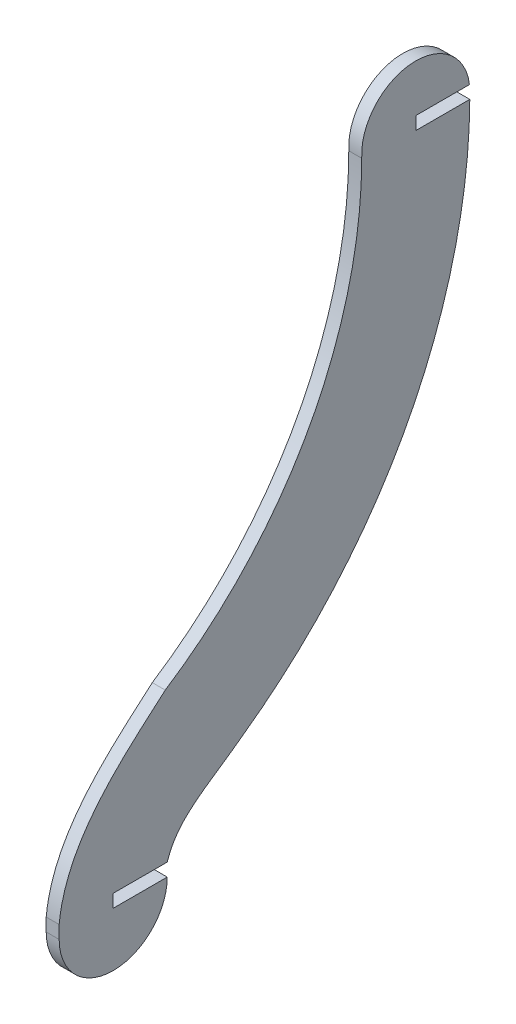
ISO-10303-21;
HEADER;
FILE_DESCRIPTION(('STEP AP214'),'2;1');
FILE_NAME('part.step','',(''),(''),'','','');
FILE_SCHEMA(('AUTOMOTIVE_DESIGN { 1 0 10303 214 1 1 1 1 }'));
ENDSEC;
DATA;
#1=APPLICATION_CONTEXT('core data for automotive mechanical design processes');
#2=APPLICATION_PROTOCOL_DEFINITION('international standard','automotive_design',2000,#1);
#3=PRODUCT_CONTEXT('',#1,'mechanical');
#4=PRODUCT('Part','Part','',(#3));
#5=PRODUCT_RELATED_PRODUCT_CATEGORY('part','',(#4));
#6=PRODUCT_DEFINITION_FORMATION('','',#4);
#7=PRODUCT_DEFINITION_CONTEXT('part definition',#1,'design');
#8=PRODUCT_DEFINITION('design','',#6,#7);
#9=PRODUCT_DEFINITION_SHAPE('','',#8);
#10=(LENGTH_UNIT() NAMED_UNIT(*) SI_UNIT(.MILLI.,.METRE.));
#11=(NAMED_UNIT(*) PLANE_ANGLE_UNIT() SI_UNIT($,.RADIAN.));
#12=(NAMED_UNIT(*) SI_UNIT($,.STERADIAN.) SOLID_ANGLE_UNIT());
#13=UNCERTAINTY_MEASURE_WITH_UNIT(LENGTH_MEASURE(1.E-05),#10,'distance_accuracy_value','');
#14=(GEOMETRIC_REPRESENTATION_CONTEXT(3) GLOBAL_UNCERTAINTY_ASSIGNED_CONTEXT((#13)) GLOBAL_UNIT_ASSIGNED_CONTEXT((#10,
#11,#12)) REPRESENTATION_CONTEXT('',''));
#15=CARTESIAN_POINT('',(0.,0.,0.));
#16=DIRECTION('',(0.,0.,1.));
#17=DIRECTION('',(1.,0.,0.));
#18=AXIS2_PLACEMENT_3D('',#15,#16,#17);
#19=CARTESIAN_POINT('',(3.,0.75,-112.5));
#20=DIRECTION('',(-1.,0.,0.));
#21=DIRECTION('',(0.,0.,1.));
#22=AXIS2_PLACEMENT_3D('',#19,#20,#21);
#23=CYLINDRICAL_SURFACE('',#22,12.5224797863682);
#24=CARTESIAN_POINT('',(3.,0.75,-112.5));
#25=DIRECTION('',(1.,0.,0.));
#26=DIRECTION('',(0.,0.,1.));
#27=AXIS2_PLACEMENT_3D('',#24,#25,#26);
#28=CIRCLE('',#27,12.5224797863682);
#29=CARTESIAN_POINT('',(3.,2.30916459984596,-124.925035442629));
#30=VERTEX_POINT('',#29);
#31=CARTESIAN_POINT('',(3.,0.,-100.));
#32=VERTEX_POINT('',#31);
#33=EDGE_CURVE('E178',#30,#32,#28,.T.);
#34=ORIENTED_EDGE('',*,*,#33,.F.);
#35=DIRECTION('',(-1.,0.,0.));
#36=VECTOR('',#35,1.);
#37=CARTESIAN_POINT('',(3.,2.30916459984596,-124.925035442629));
#38=LINE('',#37,#36);
#39=CARTESIAN_POINT('',(0.,2.30916459984596,-124.925035442629));
#40=VERTEX_POINT('',#39);
#41=EDGE_CURVE('E132',#30,#40,#38,.T.);
#42=ORIENTED_EDGE('',*,*,#41,.T.);
#43=CARTESIAN_POINT('',(0.,0.75,-112.5));
#44=DIRECTION('',(1.,0.,0.));
#45=DIRECTION('',(0.,0.,1.));
#46=AXIS2_PLACEMENT_3D('',#43,#44,#45);
#47=CIRCLE('',#46,12.5224797863682);
#48=CARTESIAN_POINT('',(0.,0.,-100.));
#49=VERTEX_POINT('',#48);
#50=EDGE_CURVE('E177',#40,#49,#47,.T.);
#51=ORIENTED_EDGE('',*,*,#50,.T.);
#52=DIRECTION('',(-1.,0.,0.));
#53=VECTOR('',#52,1.);
#54=CARTESIAN_POINT('',(3.,0.,-100.));
#55=LINE('',#54,#53);
#56=EDGE_CURVE('E40',#32,#49,#55,.T.);
#57=ORIENTED_EDGE('',*,*,#56,.F.);
#58=EDGE_LOOP('',(#34,#42,#51,#57));
#59=FACE_BOUND('',#58,.T.);
#60=ADVANCED_FACE('F33',(#59),#23,.T.);
#61=CARTESIAN_POINT('',(3.,0.,0.));
#62=DIRECTION('',(-1.,0.,0.));
#63=DIRECTION('',(0.,0.,1.));
#64=AXIS2_PLACEMENT_3D('',#61,#62,#63);
#65=CYLINDRICAL_SURFACE('',#64,100.);
#66=CARTESIAN_POINT('',(0.,0.,0.));
#67=DIRECTION('',(-1.,0.,0.));
#68=DIRECTION('',(0.,0.,1.));
#69=AXIS2_PLACEMENT_3D('',#66,#67,#68);
#70=CIRCLE('',#69,100.);
#71=CARTESIAN_POINT('',(0.,-83.8152651696344,-54.543572715251));
#72=VERTEX_POINT('',#71);
#73=EDGE_CURVE('E210',#49,#72,#70,.T.);
#74=ORIENTED_EDGE('',*,*,#73,.T.);
#75=DIRECTION('',(-1.,0.,0.));
#76=VECTOR('',#75,1.);
#77=CARTESIAN_POINT('',(3.,-83.8152651696344,-54.543572715251));
#78=LINE('',#77,#76);
#79=CARTESIAN_POINT('',(3.,-83.8152651696344,-54.543572715251));
#80=VERTEX_POINT('',#79);
#81=EDGE_CURVE('E213',#80,#72,#78,.T.);
#82=ORIENTED_EDGE('',*,*,#81,.F.);
#83=CARTESIAN_POINT('',(3.,0.,0.));
#84=DIRECTION('',(-1.,0.,0.));
#85=DIRECTION('',(0.,0.,1.));
#86=AXIS2_PLACEMENT_3D('',#83,#84,#85);
#87=CIRCLE('',#86,100.);
#88=EDGE_CURVE('E180',#32,#80,#87,.T.);
#89=ORIENTED_EDGE('',*,*,#88,.F.);
#90=ORIENTED_EDGE('',*,*,#56,.T.);
#91=EDGE_LOOP('',(#74,#82,#89,#90));
#92=FACE_BOUND('',#91,.T.);
#93=ADVANCED_FACE('F198',(#92),#65,.F.);
#94=CARTESIAN_POINT('',(3.,-83.8152651696344,-54.543572715251));
#95=CARTESIAN_POINT('',(3.,-92.6089409882353,-44.4344367811976));
#96=CARTESIAN_POINT('',(3.,-102.945692353055,-31.581333533884));
#97=CARTESIAN_POINT('',(3.,-118.5,-30.0000000000005));
#98=B_SPLINE_CURVE_WITH_KNOTS('',3,(#94,#95,#96,#97),.UNSPECIFIED.,.F.,.F.,(4,4),(0.,1.),.UNSPECIFIED.);
#99=DIRECTION('',(-1.,0.,0.));
#100=VECTOR('',#99,1.);
#101=SURFACE_OF_LINEAR_EXTRUSION('',#98,#100);
#102=CARTESIAN_POINT('',(0.,-83.8152651696344,-54.543572715251));
#103=CARTESIAN_POINT('',(0.,-92.6089409882353,-44.4344367811976));
#104=CARTESIAN_POINT('',(0.,-102.945692353055,-31.581333533884));
#105=CARTESIAN_POINT('',(0.,-118.5,-30.0000000000005));
#106=B_SPLINE_CURVE_WITH_KNOTS('',3,(#102,#103,#104,#105),.UNSPECIFIED.,.F.,.F.,(4,4),(0.,1.),.UNSPECIFIED.);
#107=CARTESIAN_POINT('',(0.,-118.5,-30.0000000000005));
#108=VERTEX_POINT('',#107);
#109=EDGE_CURVE('E217',#72,#108,#106,.T.);
#110=ORIENTED_EDGE('',*,*,#109,.T.);
#111=DIRECTION('',(-1.,0.,0.));
#112=VECTOR('',#111,1.);
#113=CARTESIAN_POINT('',(3.,-118.5,-30.0000000000005));
#114=LINE('',#113,#112);
#115=CARTESIAN_POINT('',(3.,-118.5,-30.0000000000005));
#116=VERTEX_POINT('',#115);
#117=EDGE_CURVE('E221',#116,#108,#114,.T.);
#118=ORIENTED_EDGE('',*,*,#117,.F.);
#119=EDGE_CURVE('E183',#80,#116,#98,.T.);
#120=ORIENTED_EDGE('',*,*,#119,.F.);
#121=ORIENTED_EDGE('',*,*,#81,.T.);
#122=EDGE_LOOP('',(#110,#118,#120,#121));
#123=FACE_BOUND('',#122,.T.);
#124=ADVANCED_FACE('F194',(#123),#101,.F.);
#125=CARTESIAN_POINT('',(3.,-118.5,-30.0000000000005));
#126=DIRECTION('',(0.,0.,-1.));
#127=DIRECTION('',(0.,1.,0.));
#128=AXIS2_PLACEMENT_3D('',#125,#126,#127);
#129=PLANE('',#128);
#130=DIRECTION('',(0.,-1.,0.));
#131=VECTOR('',#130,1.);
#132=CARTESIAN_POINT('',(0.,-118.5,-30.0000000000005));
#133=LINE('',#132,#131);
#134=CARTESIAN_POINT('',(0.,-121.5,-30.0000000000005));
#135=VERTEX_POINT('',#134);
#136=EDGE_CURVE('E225',#108,#135,#133,.T.);
#137=ORIENTED_EDGE('',*,*,#136,.T.);
#138=DIRECTION('',(-1.,0.,0.));
#139=VECTOR('',#138,1.);
#140=CARTESIAN_POINT('',(3.,-121.5,-30.0000000000005));
#141=LINE('',#140,#139);
#142=CARTESIAN_POINT('',(3.,-121.5,-30.0000000000005));
#143=VERTEX_POINT('',#142);
#144=EDGE_CURVE('E255',#143,#135,#141,.T.);
#145=ORIENTED_EDGE('',*,*,#144,.F.);
#146=DIRECTION('',(0.,-1.,0.));
#147=VECTOR('',#146,1.);
#148=CARTESIAN_POINT('',(3.,-118.5,-30.0000000000005));
#149=LINE('',#148,#147);
#150=EDGE_CURVE('E188',#116,#143,#149,.T.);
#151=ORIENTED_EDGE('',*,*,#150,.F.);
#152=ORIENTED_EDGE('',*,*,#117,.T.);
#153=EDGE_LOOP('',(#137,#145,#151,#152));
#154=FACE_BOUND('',#153,.T.);
#155=ADVANCED_FACE('F197',(#154),#129,.F.);
#156=CARTESIAN_POINT('',(3.,-121.5,-42.5000000000005));
#157=DIRECTION('',(-1.,0.,0.));
#158=DIRECTION('',(0.,0.,1.));
#159=AXIS2_PLACEMENT_3D('',#156,#157,#158);
#160=CYLINDRICAL_SURFACE('',#159,12.5);
#161=CARTESIAN_POINT('',(0.,-121.5,-42.5000000000005));
#162=DIRECTION('',(1.,0.,0.));
#163=DIRECTION('',(0.,0.,1.));
#164=AXIS2_PLACEMENT_3D('',#161,#162,#163);
#165=CIRCLE('',#164,12.5);
#166=CARTESIAN_POINT('',(0.,-121.5,-55.0000000000005));
#167=VERTEX_POINT('',#166);
#168=EDGE_CURVE('E227',#135,#167,#165,.T.);
#169=ORIENTED_EDGE('',*,*,#168,.T.);
#170=DIRECTION('',(-1.,0.,0.));
#171=VECTOR('',#170,1.);
#172=CARTESIAN_POINT('',(3.,-121.5,-55.0000000000005));
#173=LINE('',#172,#171);
#174=CARTESIAN_POINT('',(3.,-121.5,-55.0000000000005));
#175=VERTEX_POINT('',#174);
#176=EDGE_CURVE('E253',#175,#167,#173,.T.);
#177=ORIENTED_EDGE('',*,*,#176,.F.);
#178=CARTESIAN_POINT('',(3.,-121.5,-42.5000000000005));
#179=DIRECTION('',(1.,0.,0.));
#180=DIRECTION('',(0.,0.,1.));
#181=AXIS2_PLACEMENT_3D('',#178,#179,#180);
#182=CIRCLE('',#181,12.5);
#183=EDGE_CURVE('E264',#143,#175,#182,.T.);
#184=ORIENTED_EDGE('',*,*,#183,.F.);
#185=ORIENTED_EDGE('',*,*,#144,.T.);
#186=EDGE_LOOP('',(#169,#177,#184,#185));
#187=FACE_BOUND('',#186,.T.);
#188=ADVANCED_FACE('F281',(#187),#160,.T.);
#189=CARTESIAN_POINT('',(3.,-118.5,-55.0000000000005));
#190=CARTESIAN_POINT('',(3.,-110.868607185176,-57.3842878123047));
#191=CARTESIAN_POINT('',(3.,-107.86064176135,-64.5488560780221));
#192=CARTESIAN_POINT('',(3.,-101.935620664826,-72.3472821858341));
#193=B_SPLINE_CURVE_WITH_KNOTS('',3,(#189,#190,#191,#192),.UNSPECIFIED.,.F.,.F.,(4,4),(0.,1.),.UNSPECIFIED.);
#194=DIRECTION('',(-1.,0.,0.));
#195=VECTOR('',#194,1.);
#196=SURFACE_OF_LINEAR_EXTRUSION('',#193,#195);
#197=CARTESIAN_POINT('',(0.,-118.5,-55.0000000000005));
#198=CARTESIAN_POINT('',(0.,-110.868607185176,-57.3842878123047));
#199=CARTESIAN_POINT('',(0.,-107.86064176135,-64.5488560780221));
#200=CARTESIAN_POINT('',(0.,-101.935620664826,-72.3472821858341));
#201=B_SPLINE_CURVE_WITH_KNOTS('',3,(#197,#198,#199,#200),.UNSPECIFIED.,.F.,.F.,(4,4),(0.,1.),.UNSPECIFIED.);
#202=CARTESIAN_POINT('',(0.,-118.5,-55.0000000000005));
#203=VERTEX_POINT('',#202);
#204=CARTESIAN_POINT('',(0.,-101.935620664826,-72.3472821858341));
#205=VERTEX_POINT('',#204);
#206=EDGE_CURVE('E238',#203,#205,#201,.T.);
#207=ORIENTED_EDGE('',*,*,#206,.T.);
#208=DIRECTION('',(-1.,0.,0.));
#209=VECTOR('',#208,1.);
#210=CARTESIAN_POINT('',(3.,-101.935620664826,-72.3472821858341));
#211=LINE('',#210,#209);
#212=CARTESIAN_POINT('',(3.,-101.935620664826,-72.3472821858341));
#213=VERTEX_POINT('',#212);
#214=EDGE_CURVE('E246',#213,#205,#211,.T.);
#215=ORIENTED_EDGE('',*,*,#214,.F.);
#216=CARTESIAN_POINT('',(3.,-118.5,-55.0000000000005));
#217=VERTEX_POINT('',#216);
#218=EDGE_CURVE('E265',#217,#213,#193,.T.);
#219=ORIENTED_EDGE('',*,*,#218,.F.);
#220=DIRECTION('',(-1.,0.,0.));
#221=VECTOR('',#220,1.);
#222=CARTESIAN_POINT('',(3.,-118.5,-55.0000000000005));
#223=LINE('',#222,#221);
#224=EDGE_CURVE('E249',#217,#203,#223,.T.);
#225=ORIENTED_EDGE('',*,*,#224,.T.);
#226=EDGE_LOOP('',(#207,#215,#219,#225));
#227=FACE_BOUND('',#226,.T.);
#228=ADVANCED_FACE('F277',(#227),#196,.F.);
#229=CARTESIAN_POINT('',(3.,0.,0.));
#230=DIRECTION('',(-1.,0.,0.));
#231=DIRECTION('',(0.,0.,1.));
#232=AXIS2_PLACEMENT_3D('',#229,#230,#231);
#233=CYLINDRICAL_SURFACE('',#232,125.);
#234=CARTESIAN_POINT('',(0.,0.,0.));
#235=DIRECTION('',(1.,0.,0.));
#236=DIRECTION('',(0.,0.,1.));
#237=AXIS2_PLACEMENT_3D('',#234,#235,#236);
#238=CIRCLE('',#237,125.);
#239=CARTESIAN_POINT('',(0.,-0.690835400154035,-124.998090971222));
#240=VERTEX_POINT('',#239);
#241=EDGE_CURVE('E181',#205,#240,#238,.T.);
#242=ORIENTED_EDGE('',*,*,#241,.T.);
#243=DIRECTION('',(-1.,0.,0.));
#244=VECTOR('',#243,1.);
#245=CARTESIAN_POINT('',(3.,-0.690835400154035,-124.998090971222));
#246=LINE('',#245,#244);
#247=CARTESIAN_POINT('',(3.,-0.690835400154035,-124.998090971222));
#248=VERTEX_POINT('',#247);
#249=EDGE_CURVE('E139',#240,#248,#246,.F.);
#250=ORIENTED_EDGE('',*,*,#249,.T.);
#251=CARTESIAN_POINT('',(3.,0.,0.));
#252=DIRECTION('',(1.,0.,0.));
#253=DIRECTION('',(0.,0.,1.));
#254=AXIS2_PLACEMENT_3D('',#251,#252,#253);
#255=CIRCLE('',#254,125.);
#256=EDGE_CURVE('E250',#213,#248,#255,.T.);
#257=ORIENTED_EDGE('',*,*,#256,.F.);
#258=ORIENTED_EDGE('',*,*,#214,.T.);
#259=EDGE_LOOP('',(#242,#250,#257,#258));
#260=FACE_BOUND('',#259,.T.);
#261=ADVANCED_FACE('F280',(#260),#233,.T.);
#262=CARTESIAN_POINT('',(3.,0.75,-112.5));
#263=DIRECTION('',(-1.,0.,0.));
#264=DIRECTION('',(0.,0.,1.));
#265=AXIS2_PLACEMENT_3D('',#262,#263,#264);
#266=PLANE('',#265);
#267=ORIENTED_EDGE('',*,*,#256,.T.);
#268=DIRECTION('',(0.,0.,-1.));
#269=VECTOR('',#268,1.);
#270=CARTESIAN_POINT('',(3.,-0.690835400154035,-125.));
#271=LINE('',#270,#269);
#272=CARTESIAN_POINT('',(3.,-0.690835400154037,-112.5));
#273=VERTEX_POINT('',#272);
#274=EDGE_CURVE('E147',#273,#248,#271,.T.);
#275=ORIENTED_EDGE('',*,*,#274,.F.);
#276=DIRECTION('',(0.,-1.,0.));
#277=VECTOR('',#276,1.);
#278=CARTESIAN_POINT('',(3.,-0.690835400154037,-112.5));
#279=LINE('',#278,#277);
#280=CARTESIAN_POINT('',(3.,2.30916459984596,-112.5));
#281=VERTEX_POINT('',#280);
#282=EDGE_CURVE('E129',#281,#273,#279,.T.);
#283=ORIENTED_EDGE('',*,*,#282,.F.);
#284=DIRECTION('',(0.,0.,1.));
#285=VECTOR('',#284,1.);
#286=CARTESIAN_POINT('',(3.,2.30916459984596,-125.));
#287=LINE('',#286,#285);
#288=EDGE_CURVE('E151',#30,#281,#287,.T.);
#289=ORIENTED_EDGE('',*,*,#288,.F.);
#290=ORIENTED_EDGE('',*,*,#33,.T.);
#291=ORIENTED_EDGE('',*,*,#88,.T.);
#292=ORIENTED_EDGE('',*,*,#119,.T.);
#293=ORIENTED_EDGE('',*,*,#150,.T.);
#294=ORIENTED_EDGE('',*,*,#183,.T.);
#295=DIRECTION('',(0.,0.,-1.));
#296=VECTOR('',#295,1.);
#297=CARTESIAN_POINT('',(3.,-121.5,-55.0000000000005));
#298=LINE('',#297,#296);
#299=CARTESIAN_POINT('',(3.,-121.5,-42.5000000000005));
#300=VERTEX_POINT('',#299);
#301=EDGE_CURVE('E159',#300,#175,#298,.T.);
#302=ORIENTED_EDGE('',*,*,#301,.F.);
#303=DIRECTION('',(0.,-1.,0.));
#304=VECTOR('',#303,1.);
#305=CARTESIAN_POINT('',(3.,-118.5,-42.5000000000005));
#306=LINE('',#305,#304);
#307=CARTESIAN_POINT('',(3.,-118.5,-42.5000000000005));
#308=VERTEX_POINT('',#307);
#309=EDGE_CURVE('E168',#308,#300,#306,.T.);
#310=ORIENTED_EDGE('',*,*,#309,.F.);
#311=DIRECTION('',(0.,0.,1.));
#312=VECTOR('',#311,1.);
#313=CARTESIAN_POINT('',(3.,-118.5,-55.0000000000005));
#314=LINE('',#313,#312);
#315=EDGE_CURVE('E165',#217,#308,#314,.T.);
#316=ORIENTED_EDGE('',*,*,#315,.F.);
#317=ORIENTED_EDGE('',*,*,#218,.T.);
#318=EDGE_LOOP('',(#267,#275,#283,#289,#290,#291,#292,#293,#294,#302,#310,#316,#317));
#319=FACE_BOUND('',#318,.T.);
#320=ADVANCED_FACE('F294',(#319),#266,.F.);
#321=CARTESIAN_POINT('',(0.,0.75,-112.5));
#322=DIRECTION('',(-1.,0.,0.));
#323=DIRECTION('',(0.,0.,1.));
#324=AXIS2_PLACEMENT_3D('',#321,#322,#323);
#325=PLANE('',#324);
#326=DIRECTION('',(0.,0.,-1.));
#327=VECTOR('',#326,1.);
#328=CARTESIAN_POINT('',(0.,-0.690835400154035,-125.));
#329=LINE('',#328,#327);
#330=CARTESIAN_POINT('',(0.,-0.690835400154037,-112.5));
#331=VERTEX_POINT('',#330);
#332=EDGE_CURVE('E136',#331,#240,#329,.T.);
#333=ORIENTED_EDGE('',*,*,#332,.T.);
#334=ORIENTED_EDGE('',*,*,#241,.F.);
#335=ORIENTED_EDGE('',*,*,#206,.F.);
#336=DIRECTION('',(0.,0.,1.));
#337=VECTOR('',#336,1.);
#338=CARTESIAN_POINT('',(0.,-118.5,-55.0000000000005));
#339=LINE('',#338,#337);
#340=CARTESIAN_POINT('',(0.,-118.5,-42.5000000000005));
#341=VERTEX_POINT('',#340);
#342=EDGE_CURVE('E156',#203,#341,#339,.T.);
#343=ORIENTED_EDGE('',*,*,#342,.T.);
#344=DIRECTION('',(0.,-1.,0.));
#345=VECTOR('',#344,1.);
#346=CARTESIAN_POINT('',(0.,-118.5,-42.5000000000005));
#347=LINE('',#346,#345);
#348=CARTESIAN_POINT('',(0.,-121.5,-42.5000000000005));
#349=VERTEX_POINT('',#348);
#350=EDGE_CURVE('E55',#341,#349,#347,.T.);
#351=ORIENTED_EDGE('',*,*,#350,.T.);
#352=DIRECTION('',(0.,0.,-1.));
#353=VECTOR('',#352,1.);
#354=CARTESIAN_POINT('',(0.,-121.5,-55.0000000000005));
#355=LINE('',#354,#353);
#356=EDGE_CURVE('E161',#349,#167,#355,.T.);
#357=ORIENTED_EDGE('',*,*,#356,.T.);
#358=ORIENTED_EDGE('',*,*,#168,.F.);
#359=ORIENTED_EDGE('',*,*,#136,.F.);
#360=ORIENTED_EDGE('',*,*,#109,.F.);
#361=ORIENTED_EDGE('',*,*,#73,.F.);
#362=ORIENTED_EDGE('',*,*,#50,.F.);
#363=DIRECTION('',(0.,0.,-1.));
#364=VECTOR('',#363,1.);
#365=CARTESIAN_POINT('',(0.,2.30916459984596,-112.5));
#366=LINE('',#365,#364);
#367=CARTESIAN_POINT('',(0.,2.30916459984596,-112.5));
#368=VERTEX_POINT('',#367);
#369=EDGE_CURVE('E11',#368,#40,#366,.T.);
#370=ORIENTED_EDGE('',*,*,#369,.F.);
#371=DIRECTION('',(0.,-1.,0.));
#372=VECTOR('',#371,1.);
#373=CARTESIAN_POINT('',(0.,-0.690835400154037,-112.5));
#374=LINE('',#373,#372);
#375=EDGE_CURVE('E47',#368,#331,#374,.T.);
#376=ORIENTED_EDGE('',*,*,#375,.T.);
#377=EDGE_LOOP('',(#333,#334,#335,#343,#351,#357,#358,#359,#360,#361,#362,#370,#376));
#378=FACE_BOUND('',#377,.T.);
#379=ADVANCED_FACE('F145',(#378),#325,.T.);
#380=CARTESIAN_POINT('',(0.,-121.5,-55.0000000000005));
#381=DIRECTION('',(0.,-1.,0.));
#382=DIRECTION('',(0.,0.,-1.));
#383=AXIS2_PLACEMENT_3D('',#380,#381,#382);
#384=PLANE('',#383);
#385=ORIENTED_EDGE('',*,*,#301,.T.);
#386=ORIENTED_EDGE('',*,*,#176,.T.);
#387=ORIENTED_EDGE('',*,*,#356,.F.);
#388=DIRECTION('',(1.,0.,0.));
#389=VECTOR('',#388,1.);
#390=CARTESIAN_POINT('',(0.,-121.5,-42.5000000000005));
#391=LINE('',#390,#389);
#392=EDGE_CURVE('E153',#349,#300,#391,.T.);
#393=ORIENTED_EDGE('',*,*,#392,.T.);
#394=EDGE_LOOP('',(#385,#386,#387,#393));
#395=FACE_BOUND('',#394,.T.);
#396=ADVANCED_FACE('F291',(#395),#384,.F.);
#397=CARTESIAN_POINT('',(0.,-118.5,-42.5000000000005));
#398=DIRECTION('',(0.,0.,1.));
#399=DIRECTION('',(1.,0.,0.));
#400=AXIS2_PLACEMENT_3D('',#397,#398,#399);
#401=PLANE('',#400);
#402=ORIENTED_EDGE('',*,*,#309,.T.);
#403=ORIENTED_EDGE('',*,*,#392,.F.);
#404=ORIENTED_EDGE('',*,*,#350,.F.);
#405=DIRECTION('',(1.,0.,0.));
#406=VECTOR('',#405,1.);
#407=CARTESIAN_POINT('',(0.,-118.5,-42.5000000000005));
#408=LINE('',#407,#406);
#409=EDGE_CURVE('E164',#341,#308,#408,.T.);
#410=ORIENTED_EDGE('',*,*,#409,.T.);
#411=EDGE_LOOP('',(#402,#403,#404,#410));
#412=FACE_BOUND('',#411,.T.);
#413=ADVANCED_FACE('F297',(#412),#401,.F.);
#414=CARTESIAN_POINT('',(0.,-118.5,-55.0000000000005));
#415=DIRECTION('',(0.,1.,0.));
#416=DIRECTION('',(0.,0.,1.));
#417=AXIS2_PLACEMENT_3D('',#414,#415,#416);
#418=PLANE('',#417);
#419=ORIENTED_EDGE('',*,*,#315,.T.);
#420=ORIENTED_EDGE('',*,*,#409,.F.);
#421=ORIENTED_EDGE('',*,*,#342,.F.);
#422=ORIENTED_EDGE('',*,*,#224,.F.);
#423=EDGE_LOOP('',(#419,#420,#421,#422));
#424=FACE_BOUND('',#423,.T.);
#425=ADVANCED_FACE('F299',(#424),#418,.F.);
#426=CARTESIAN_POINT('',(0.,-0.690835400154035,-125.));
#427=DIRECTION('',(0.,-1.,0.));
#428=DIRECTION('',(0.,0.,-1.));
#429=AXIS2_PLACEMENT_3D('',#426,#427,#428);
#430=PLANE('',#429);
#431=ORIENTED_EDGE('',*,*,#332,.F.);
#432=DIRECTION('',(1.,0.,0.));
#433=VECTOR('',#432,1.);
#434=CARTESIAN_POINT('',(0.,-0.690835400154037,-112.5));
#435=LINE('',#434,#433);
#436=EDGE_CURVE('E125',#331,#273,#435,.T.);
#437=ORIENTED_EDGE('',*,*,#436,.T.);
#438=ORIENTED_EDGE('',*,*,#274,.T.);
#439=ORIENTED_EDGE('',*,*,#249,.F.);
#440=EDGE_LOOP('',(#431,#437,#438,#439));
#441=FACE_BOUND('',#440,.T.);
#442=ADVANCED_FACE('F137',(#441),#430,.F.);
#443=CARTESIAN_POINT('',(0.,2.30916459984596,-125.));
#444=DIRECTION('',(0.,1.,0.));
#445=DIRECTION('',(0.,0.,1.));
#446=AXIS2_PLACEMENT_3D('',#443,#444,#445);
#447=PLANE('',#446);
#448=ORIENTED_EDGE('',*,*,#288,.T.);
#449=DIRECTION('',(1.,0.,0.));
#450=VECTOR('',#449,1.);
#451=CARTESIAN_POINT('',(0.,2.30916459984596,-112.5));
#452=LINE('',#451,#450);
#453=EDGE_CURVE('E133',#368,#281,#452,.T.);
#454=ORIENTED_EDGE('',*,*,#453,.F.);
#455=ORIENTED_EDGE('',*,*,#369,.T.);
#456=ORIENTED_EDGE('',*,*,#41,.F.);
#457=EDGE_LOOP('',(#448,#454,#455,#456));
#458=FACE_BOUND('',#457,.T.);
#459=ADVANCED_FACE('F307',(#458),#447,.F.);
#460=CARTESIAN_POINT('',(0.,-0.690835400154037,-112.5));
#461=DIRECTION('',(0.,0.,1.));
#462=DIRECTION('',(1.,0.,0.));
#463=AXIS2_PLACEMENT_3D('',#460,#461,#462);
#464=PLANE('',#463);
#465=ORIENTED_EDGE('',*,*,#282,.T.);
#466=ORIENTED_EDGE('',*,*,#436,.F.);
#467=ORIENTED_EDGE('',*,*,#375,.F.);
#468=ORIENTED_EDGE('',*,*,#453,.T.);
#469=EDGE_LOOP('',(#465,#466,#467,#468));
#470=FACE_BOUND('',#469,.T.);
#471=ADVANCED_FACE('F127',(#470),#464,.F.);
#472=CLOSED_SHELL('',(#60,#93,#124,#155,#188,#228,#261,#320,#379,#396,#413,#425,#442,#459,#471));
#473=MANIFOLD_SOLID_BREP('B2',#472);
#474=ADVANCED_BREP_SHAPE_REPRESENTATION('',(#18,#473),#14);
#475=SHAPE_DEFINITION_REPRESENTATION(#9,#474);
ENDSEC;
END-ISO-10303-21;
